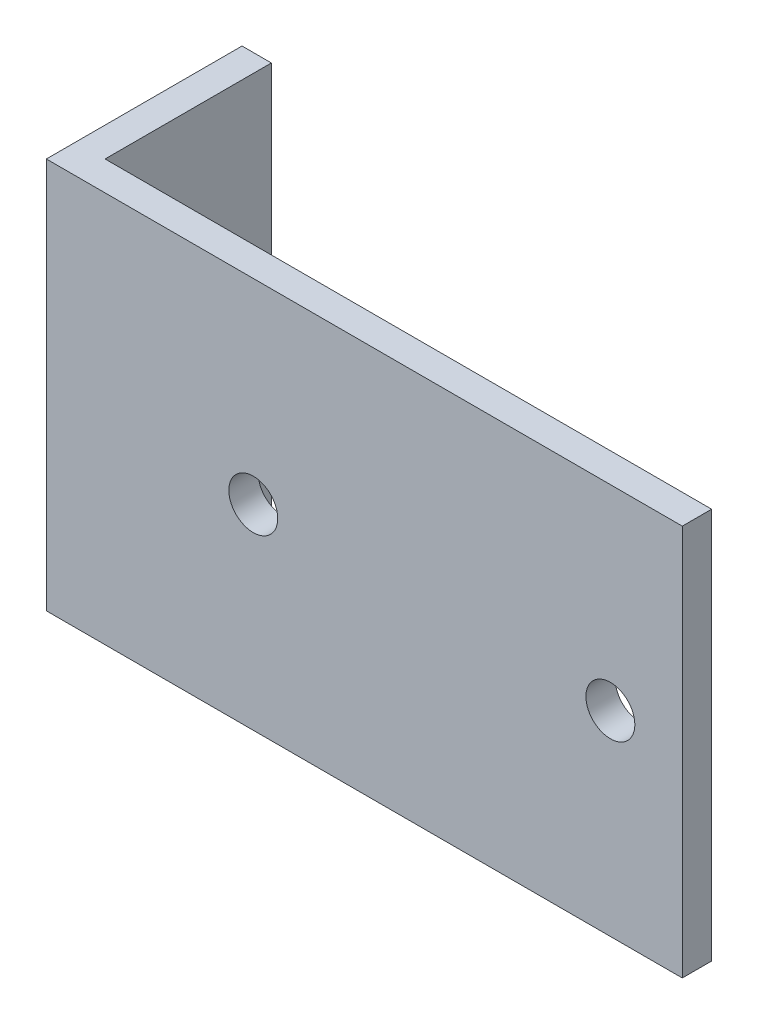
ISO-10303-21;
HEADER;
FILE_DESCRIPTION(('STEP AP214'),'2;1');
FILE_NAME('part.step','',(''),(''),'','','');
FILE_SCHEMA(('AUTOMOTIVE_DESIGN { 1 0 10303 214 1 1 1 1 }'));
ENDSEC;
DATA;
#1=APPLICATION_CONTEXT('core data for automotive mechanical design processes');
#2=APPLICATION_PROTOCOL_DEFINITION('international standard','automotive_design',2000,#1);
#3=PRODUCT_CONTEXT('',#1,'mechanical');
#4=PRODUCT('Part','Part','',(#3));
#5=PRODUCT_RELATED_PRODUCT_CATEGORY('part','',(#4));
#6=PRODUCT_DEFINITION_FORMATION('','',#4);
#7=PRODUCT_DEFINITION_CONTEXT('part definition',#1,'design');
#8=PRODUCT_DEFINITION('design','',#6,#7);
#9=PRODUCT_DEFINITION_SHAPE('','',#8);
#10=(LENGTH_UNIT() NAMED_UNIT(*) SI_UNIT(.MILLI.,.METRE.));
#11=(NAMED_UNIT(*) PLANE_ANGLE_UNIT() SI_UNIT($,.RADIAN.));
#12=(NAMED_UNIT(*) SI_UNIT($,.STERADIAN.) SOLID_ANGLE_UNIT());
#13=UNCERTAINTY_MEASURE_WITH_UNIT(LENGTH_MEASURE(1.E-05),#10,'distance_accuracy_value','');
#14=(GEOMETRIC_REPRESENTATION_CONTEXT(3) GLOBAL_UNCERTAINTY_ASSIGNED_CONTEXT((#13)) GLOBAL_UNIT_ASSIGNED_CONTEXT((#10,
#11,#12)) REPRESENTATION_CONTEXT('',''));
#15=CARTESIAN_POINT('',(0.,0.,0.));
#16=DIRECTION('',(0.,0.,1.));
#17=DIRECTION('',(1.,0.,0.));
#18=AXIS2_PLACEMENT_3D('',#15,#16,#17);
#19=CARTESIAN_POINT('',(65.,40.,0.));
#20=DIRECTION('',(0.,0.,-1.));
#21=DIRECTION('',(-1.,0.,0.));
#22=AXIS2_PLACEMENT_3D('',#19,#20,#21);
#23=PLANE('',#22);
#24=CARTESIAN_POINT('',(21.15,20.,0.));
#25=DIRECTION('',(0.,0.,1.));
#26=DIRECTION('',(1.,0.,0.));
#27=AXIS2_PLACEMENT_3D('',#24,#25,#26);
#28=CIRCLE('',#27,2.5);
#29=CARTESIAN_POINT('',(23.65,20.,0.));
#30=VERTEX_POINT('',#29);
#31=EDGE_CURVE('E158',#30,#30,#28,.T.);
#32=ORIENTED_EDGE('',*,*,#31,.F.);
#33=EDGE_LOOP('',(#32));
#34=FACE_BOUND('',#33,.T.);
#35=CARTESIAN_POINT('',(57.65,20.,0.));
#36=DIRECTION('',(0.,0.,1.));
#37=DIRECTION('',(1.,0.,0.));
#38=AXIS2_PLACEMENT_3D('',#35,#36,#37);
#39=CIRCLE('',#38,2.5);
#40=CARTESIAN_POINT('',(60.15,20.,0.));
#41=VERTEX_POINT('',#40);
#42=EDGE_CURVE('E165',#41,#41,#39,.T.);
#43=ORIENTED_EDGE('',*,*,#42,.F.);
#44=EDGE_LOOP('',(#43));
#45=FACE_BOUND('',#44,.T.);
#46=DIRECTION('',(1.,0.,0.));
#47=VECTOR('',#46,1.);
#48=CARTESIAN_POINT('',(65.,0.,0.));
#49=LINE('',#48,#47);
#50=CARTESIAN_POINT('',(0.,0.,0.));
#51=VERTEX_POINT('',#50);
#52=CARTESIAN_POINT('',(65.,0.,0.));
#53=VERTEX_POINT('',#52);
#54=EDGE_CURVE('E130',#51,#53,#49,.T.);
#55=ORIENTED_EDGE('',*,*,#54,.T.);
#56=DIRECTION('',(0.,-1.,0.));
#57=VECTOR('',#56,1.);
#58=CARTESIAN_POINT('',(65.,40.,0.));
#59=LINE('',#58,#57);
#60=CARTESIAN_POINT('',(65.,40.,0.));
#61=VERTEX_POINT('',#60);
#62=EDGE_CURVE('E11',#61,#53,#59,.T.);
#63=ORIENTED_EDGE('',*,*,#62,.F.);
#64=DIRECTION('',(1.,0.,0.));
#65=VECTOR('',#64,1.);
#66=CARTESIAN_POINT('',(65.,40.,0.));
#67=LINE('',#66,#65);
#68=CARTESIAN_POINT('',(0.,40.,0.));
#69=VERTEX_POINT('',#68);
#70=EDGE_CURVE('E146',#69,#61,#67,.T.);
#71=ORIENTED_EDGE('',*,*,#70,.F.);
#72=DIRECTION('',(0.,-1.,0.));
#73=VECTOR('',#72,1.);
#74=CARTESIAN_POINT('',(0.,40.,0.));
#75=LINE('',#74,#73);
#76=EDGE_CURVE('E126',#69,#51,#75,.T.);
#77=ORIENTED_EDGE('',*,*,#76,.T.);
#78=EDGE_LOOP('',(#55,#63,#71,#77));
#79=FACE_BOUND('',#78,.T.);
#80=ADVANCED_FACE('F39',(#34,#45,#79),#23,.F.);
#81=CARTESIAN_POINT('',(65.,40.,-3.00000000000001));
#82=DIRECTION('',(-1.,0.,0.));
#83=DIRECTION('',(0.,0.,1.));
#84=AXIS2_PLACEMENT_3D('',#81,#82,#83);
#85=PLANE('',#84);
#86=DIRECTION('',(0.,0.,-1.));
#87=VECTOR('',#86,1.);
#88=CARTESIAN_POINT('',(65.,0.,-3.00000000000001));
#89=LINE('',#88,#87);
#90=CARTESIAN_POINT('',(65.,0.,-3.00000000000001));
#91=VERTEX_POINT('',#90);
#92=EDGE_CURVE('E134',#53,#91,#89,.T.);
#93=ORIENTED_EDGE('',*,*,#92,.T.);
#94=DIRECTION('',(0.,-1.,0.));
#95=VECTOR('',#94,1.);
#96=CARTESIAN_POINT('',(65.,40.,-3.00000000000001));
#97=LINE('',#96,#95);
#98=CARTESIAN_POINT('',(65.,40.,-3.00000000000001));
#99=VERTEX_POINT('',#98);
#100=EDGE_CURVE('E49',#99,#91,#97,.T.);
#101=ORIENTED_EDGE('',*,*,#100,.F.);
#102=DIRECTION('',(0.,0.,-1.));
#103=VECTOR('',#102,1.);
#104=CARTESIAN_POINT('',(65.,40.,-3.00000000000001));
#105=LINE('',#104,#103);
#106=EDGE_CURVE('E95',#61,#99,#105,.T.);
#107=ORIENTED_EDGE('',*,*,#106,.F.);
#108=ORIENTED_EDGE('',*,*,#62,.T.);
#109=EDGE_LOOP('',(#93,#101,#107,#108));
#110=FACE_BOUND('',#109,.T.);
#111=ADVANCED_FACE('F179',(#110),#85,.F.);
#112=CARTESIAN_POINT('',(3.,40.,-3.));
#113=DIRECTION('',(0.,0.,1.));
#114=DIRECTION('',(1.,0.,0.));
#115=AXIS2_PLACEMENT_3D('',#112,#113,#114);
#116=PLANE('',#115);
#117=CARTESIAN_POINT('',(21.15,20.,-3.));
#118=DIRECTION('',(0.,0.,1.));
#119=DIRECTION('',(1.,0.,0.));
#120=AXIS2_PLACEMENT_3D('',#117,#118,#119);
#121=CIRCLE('',#120,2.5);
#122=CARTESIAN_POINT('',(23.65,20.,-3.));
#123=VERTEX_POINT('',#122);
#124=EDGE_CURVE('E42',#123,#123,#121,.T.);
#125=ORIENTED_EDGE('',*,*,#124,.T.);
#126=EDGE_LOOP('',(#125));
#127=FACE_BOUND('',#126,.T.);
#128=CARTESIAN_POINT('',(57.65,20.,-3.));
#129=DIRECTION('',(0.,0.,1.));
#130=DIRECTION('',(1.,0.,0.));
#131=AXIS2_PLACEMENT_3D('',#128,#129,#130);
#132=CIRCLE('',#131,2.5);
#133=CARTESIAN_POINT('',(60.15,20.,-3.));
#134=VERTEX_POINT('',#133);
#135=EDGE_CURVE('E155',#134,#134,#132,.T.);
#136=ORIENTED_EDGE('',*,*,#135,.T.);
#137=EDGE_LOOP('',(#136));
#138=FACE_BOUND('',#137,.T.);
#139=DIRECTION('',(-1.,0.,0.));
#140=VECTOR('',#139,1.);
#141=CARTESIAN_POINT('',(3.,0.,-3.));
#142=LINE('',#141,#140);
#143=CARTESIAN_POINT('',(3.,0.,-3.));
#144=VERTEX_POINT('',#143);
#145=EDGE_CURVE('E137',#91,#144,#142,.T.);
#146=ORIENTED_EDGE('',*,*,#145,.T.);
#147=DIRECTION('',(0.,-1.,0.));
#148=VECTOR('',#147,1.);
#149=CARTESIAN_POINT('',(3.,40.,-3.));
#150=LINE('',#149,#148);
#151=CARTESIAN_POINT('',(3.,40.,-3.));
#152=VERTEX_POINT('',#151);
#153=EDGE_CURVE('E119',#152,#144,#150,.T.);
#154=ORIENTED_EDGE('',*,*,#153,.F.);
#155=DIRECTION('',(-1.,0.,0.));
#156=VECTOR('',#155,1.);
#157=CARTESIAN_POINT('',(3.,40.,-3.));
#158=LINE('',#157,#156);
#159=EDGE_CURVE('E108',#99,#152,#158,.T.);
#160=ORIENTED_EDGE('',*,*,#159,.F.);
#161=ORIENTED_EDGE('',*,*,#100,.T.);
#162=EDGE_LOOP('',(#146,#154,#160,#161));
#163=FACE_BOUND('',#162,.T.);
#164=ADVANCED_FACE('F182',(#127,#138,#163),#116,.F.);
#165=CARTESIAN_POINT('',(3.,40.,-20.));
#166=DIRECTION('',(-1.,0.,0.));
#167=DIRECTION('',(0.,0.,1.));
#168=AXIS2_PLACEMENT_3D('',#165,#166,#167);
#169=PLANE('',#168);
#170=DIRECTION('',(0.,0.,-1.));
#171=VECTOR('',#170,1.);
#172=CARTESIAN_POINT('',(3.,0.,-20.));
#173=LINE('',#172,#171);
#174=CARTESIAN_POINT('',(3.,0.,-20.));
#175=VERTEX_POINT('',#174);
#176=EDGE_CURVE('E117',#144,#175,#173,.T.);
#177=ORIENTED_EDGE('',*,*,#176,.T.);
#178=DIRECTION('',(0.,-1.,0.));
#179=VECTOR('',#178,1.);
#180=CARTESIAN_POINT('',(3.,40.,-20.));
#181=LINE('',#180,#179);
#182=CARTESIAN_POINT('',(3.,40.,-20.));
#183=VERTEX_POINT('',#182);
#184=EDGE_CURVE('E114',#183,#175,#181,.T.);
#185=ORIENTED_EDGE('',*,*,#184,.F.);
#186=DIRECTION('',(0.,0.,-1.));
#187=VECTOR('',#186,1.);
#188=CARTESIAN_POINT('',(3.,40.,-20.));
#189=LINE('',#188,#187);
#190=EDGE_CURVE('E102',#152,#183,#189,.T.);
#191=ORIENTED_EDGE('',*,*,#190,.F.);
#192=ORIENTED_EDGE('',*,*,#153,.T.);
#193=EDGE_LOOP('',(#177,#185,#191,#192));
#194=FACE_BOUND('',#193,.T.);
#195=ADVANCED_FACE('F115',(#194),#169,.F.);
#196=CARTESIAN_POINT('',(0.,40.,-20.));
#197=DIRECTION('',(0.,0.,1.));
#198=DIRECTION('',(1.,0.,0.));
#199=AXIS2_PLACEMENT_3D('',#196,#197,#198);
#200=PLANE('',#199);
#201=DIRECTION('',(-1.,0.,0.));
#202=VECTOR('',#201,1.);
#203=CARTESIAN_POINT('',(0.,0.,-20.));
#204=LINE('',#203,#202);
#205=CARTESIAN_POINT('',(0.,0.,-20.));
#206=VERTEX_POINT('',#205);
#207=EDGE_CURVE('E81',#175,#206,#204,.T.);
#208=ORIENTED_EDGE('',*,*,#207,.T.);
#209=DIRECTION('',(0.,-1.,0.));
#210=VECTOR('',#209,1.);
#211=CARTESIAN_POINT('',(0.,40.,-20.));
#212=LINE('',#211,#210);
#213=CARTESIAN_POINT('',(0.,40.,-20.));
#214=VERTEX_POINT('',#213);
#215=EDGE_CURVE('E120',#214,#206,#212,.T.);
#216=ORIENTED_EDGE('',*,*,#215,.F.);
#217=DIRECTION('',(-1.,0.,0.));
#218=VECTOR('',#217,1.);
#219=CARTESIAN_POINT('',(0.,40.,-20.));
#220=LINE('',#219,#218);
#221=EDGE_CURVE('E106',#183,#214,#220,.T.);
#222=ORIENTED_EDGE('',*,*,#221,.F.);
#223=ORIENTED_EDGE('',*,*,#184,.T.);
#224=EDGE_LOOP('',(#208,#216,#222,#223));
#225=FACE_BOUND('',#224,.T.);
#226=ADVANCED_FACE('F122',(#225),#200,.F.);
#227=CARTESIAN_POINT('',(0.,40.,0.));
#228=DIRECTION('',(1.,0.,0.));
#229=DIRECTION('',(0.,0.,-1.));
#230=AXIS2_PLACEMENT_3D('',#227,#228,#229);
#231=PLANE('',#230);
#232=DIRECTION('',(0.,0.,1.));
#233=VECTOR('',#232,1.);
#234=CARTESIAN_POINT('',(0.,0.,0.));
#235=LINE('',#234,#233);
#236=EDGE_CURVE('E87',#206,#51,#235,.T.);
#237=ORIENTED_EDGE('',*,*,#236,.T.);
#238=ORIENTED_EDGE('',*,*,#76,.F.);
#239=DIRECTION('',(0.,0.,1.));
#240=VECTOR('',#239,1.);
#241=CARTESIAN_POINT('',(0.,40.,0.));
#242=LINE('',#241,#240);
#243=EDGE_CURVE('E58',#214,#69,#242,.T.);
#244=ORIENTED_EDGE('',*,*,#243,.F.);
#245=ORIENTED_EDGE('',*,*,#215,.T.);
#246=EDGE_LOOP('',(#237,#238,#244,#245));
#247=FACE_BOUND('',#246,.T.);
#248=ADVANCED_FACE('F187',(#247),#231,.F.);
#249=CARTESIAN_POINT('',(0.,40.,0.));
#250=DIRECTION('',(0.,-1.,0.));
#251=DIRECTION('',(0.,0.,-1.));
#252=AXIS2_PLACEMENT_3D('',#249,#250,#251);
#253=PLANE('',#252);
#254=ORIENTED_EDGE('',*,*,#70,.T.);
#255=ORIENTED_EDGE('',*,*,#106,.T.);
#256=ORIENTED_EDGE('',*,*,#159,.T.);
#257=ORIENTED_EDGE('',*,*,#190,.T.);
#258=ORIENTED_EDGE('',*,*,#221,.T.);
#259=ORIENTED_EDGE('',*,*,#243,.T.);
#260=EDGE_LOOP('',(#254,#255,#256,#257,#258,#259));
#261=FACE_BOUND('',#260,.T.);
#262=ADVANCED_FACE('F104',(#261),#253,.F.);
#263=CARTESIAN_POINT('',(0.,0.,0.));
#264=DIRECTION('',(0.,-1.,0.));
#265=DIRECTION('',(0.,0.,-1.));
#266=AXIS2_PLACEMENT_3D('',#263,#264,#265);
#267=PLANE('',#266);
#268=ORIENTED_EDGE('',*,*,#54,.F.);
#269=ORIENTED_EDGE('',*,*,#236,.F.);
#270=ORIENTED_EDGE('',*,*,#207,.F.);
#271=ORIENTED_EDGE('',*,*,#176,.F.);
#272=ORIENTED_EDGE('',*,*,#145,.F.);
#273=ORIENTED_EDGE('',*,*,#92,.F.);
#274=EDGE_LOOP('',(#268,#269,#270,#271,#272,#273));
#275=FACE_BOUND('',#274,.T.);
#276=ADVANCED_FACE('F185',(#275),#267,.T.);
#277=CARTESIAN_POINT('',(57.65,20.,-20.));
#278=DIRECTION('',(0.,0.,1.));
#279=DIRECTION('',(1.,0.,0.));
#280=AXIS2_PLACEMENT_3D('',#277,#278,#279);
#281=CYLINDRICAL_SURFACE('',#280,2.5);
#282=ORIENTED_EDGE('',*,*,#42,.T.);
#283=EDGE_LOOP('',(#282));
#284=FACE_BOUND('',#283,.T.);
#285=ORIENTED_EDGE('',*,*,#135,.F.);
#286=EDGE_LOOP('',(#285));
#287=FACE_BOUND('',#286,.T.);
#288=ADVANCED_FACE('F205',(#284,#287),#281,.F.);
#289=CARTESIAN_POINT('',(21.15,20.,-20.));
#290=DIRECTION('',(0.,0.,1.));
#291=DIRECTION('',(1.,0.,0.));
#292=AXIS2_PLACEMENT_3D('',#289,#290,#291);
#293=CYLINDRICAL_SURFACE('',#292,2.5);
#294=ORIENTED_EDGE('',*,*,#31,.T.);
#295=EDGE_LOOP('',(#294));
#296=FACE_BOUND('',#295,.T.);
#297=ORIENTED_EDGE('',*,*,#124,.F.);
#298=EDGE_LOOP('',(#297));
#299=FACE_BOUND('',#298,.T.);
#300=ADVANCED_FACE('F208',(#296,#299),#293,.F.);
#301=CLOSED_SHELL('',(#80,#111,#164,#195,#226,#248,#262,#276,#288,#300));
#302=MANIFOLD_SOLID_BREP('B2',#301);
#303=ADVANCED_BREP_SHAPE_REPRESENTATION('',(#18,#302),#14);
#304=SHAPE_DEFINITION_REPRESENTATION(#9,#303);
ENDSEC;
END-ISO-10303-21;
